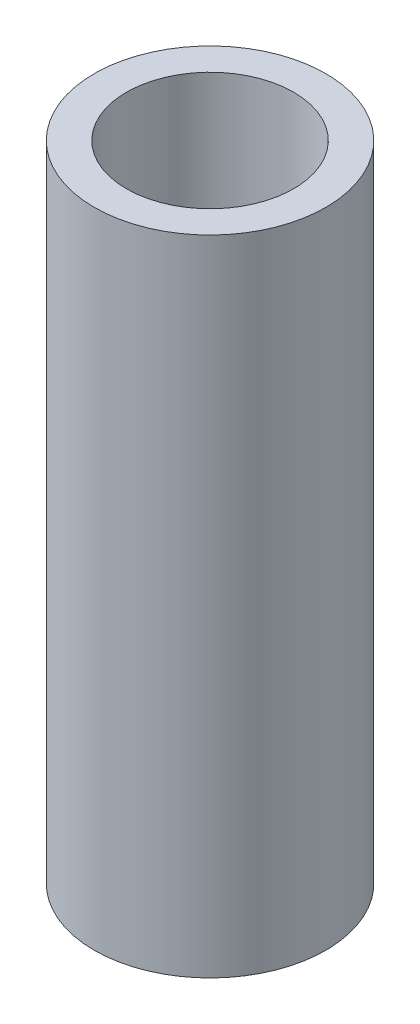
ISO-10303-21;
HEADER;
FILE_DESCRIPTION(('STEP AP214'),'2;1');
FILE_NAME('part.step','',(''),(''),'','','');
FILE_SCHEMA(('AUTOMOTIVE_DESIGN { 1 0 10303 214 1 1 1 1 }'));
ENDSEC;
DATA;
#1=APPLICATION_CONTEXT('core data for automotive mechanical design processes');
#2=APPLICATION_PROTOCOL_DEFINITION('international standard','automotive_design',2000,#1);
#3=PRODUCT_CONTEXT('',#1,'mechanical');
#4=PRODUCT('Part','Part','',(#3));
#5=PRODUCT_RELATED_PRODUCT_CATEGORY('part','',(#4));
#6=PRODUCT_DEFINITION_FORMATION('','',#4);
#7=PRODUCT_DEFINITION_CONTEXT('part definition',#1,'design');
#8=PRODUCT_DEFINITION('design','',#6,#7);
#9=PRODUCT_DEFINITION_SHAPE('','',#8);
#10=(LENGTH_UNIT() NAMED_UNIT(*) SI_UNIT(.MILLI.,.METRE.));
#11=(NAMED_UNIT(*) PLANE_ANGLE_UNIT() SI_UNIT($,.RADIAN.));
#12=(NAMED_UNIT(*) SI_UNIT($,.STERADIAN.) SOLID_ANGLE_UNIT());
#13=UNCERTAINTY_MEASURE_WITH_UNIT(LENGTH_MEASURE(1.E-05),#10,'distance_accuracy_value','');
#14=(GEOMETRIC_REPRESENTATION_CONTEXT(3) GLOBAL_UNCERTAINTY_ASSIGNED_CONTEXT((#13)) GLOBAL_UNIT_ASSIGNED_CONTEXT((#10,
#11,#12)) REPRESENTATION_CONTEXT('',''));
#15=CARTESIAN_POINT('',(0.,0.,0.));
#16=DIRECTION('',(0.,0.,1.));
#17=DIRECTION('',(1.,0.,0.));
#18=AXIS2_PLACEMENT_3D('',#15,#16,#17);
#19=CARTESIAN_POINT('',(0.,25.,0.));
#20=DIRECTION('',(0.,1.,0.));
#21=DIRECTION('',(0.,0.,1.));
#22=AXIS2_PLACEMENT_3D('',#19,#20,#21);
#23=PLANE('',#22);
#24=CARTESIAN_POINT('',(0.,25.,0.));
#25=DIRECTION('',(0.,1.,0.));
#26=DIRECTION('',(0.,0.,1.));
#27=AXIS2_PLACEMENT_3D('',#24,#25,#26);
#28=CIRCLE('',#27,4.5);
#29=CARTESIAN_POINT('',(0.,25.,4.5));
#30=VERTEX_POINT('',#29);
#31=EDGE_CURVE('E10',#30,#30,#28,.T.);
#32=ORIENTED_EDGE('',*,*,#31,.T.);
#33=EDGE_LOOP('',(#32));
#34=FACE_BOUND('',#33,.T.);
#35=CARTESIAN_POINT('',(0.,25.,0.));
#36=DIRECTION('',(0.,1.,0.));
#37=DIRECTION('',(0.,0.,1.));
#38=AXIS2_PLACEMENT_3D('',#35,#36,#37);
#39=CIRCLE('',#38,3.25);
#40=CARTESIAN_POINT('',(0.,25.,3.25));
#41=VERTEX_POINT('',#40);
#42=EDGE_CURVE('E42',#41,#41,#39,.T.);
#43=ORIENTED_EDGE('',*,*,#42,.F.);
#44=EDGE_LOOP('',(#43));
#45=FACE_BOUND('',#44,.T.);
#46=ADVANCED_FACE('F31',(#34,#45),#23,.T.);
#47=CARTESIAN_POINT('',(0.,0.,0.));
#48=DIRECTION('',(0.,1.,0.));
#49=DIRECTION('',(0.,0.,1.));
#50=AXIS2_PLACEMENT_3D('',#47,#48,#49);
#51=PLANE('',#50);
#52=CARTESIAN_POINT('',(0.,0.,0.));
#53=DIRECTION('',(0.,1.,0.));
#54=DIRECTION('',(0.,0.,1.));
#55=AXIS2_PLACEMENT_3D('',#52,#53,#54);
#56=CIRCLE('',#55,4.5);
#57=CARTESIAN_POINT('',(0.,0.,4.5));
#58=VERTEX_POINT('',#57);
#59=EDGE_CURVE('E35',#58,#58,#56,.T.);
#60=ORIENTED_EDGE('',*,*,#59,.F.);
#61=EDGE_LOOP('',(#60));
#62=FACE_BOUND('',#61,.T.);
#63=CARTESIAN_POINT('',(0.,0.,0.));
#64=DIRECTION('',(0.,1.,0.));
#65=DIRECTION('',(0.,0.,1.));
#66=AXIS2_PLACEMENT_3D('',#63,#64,#65);
#67=CIRCLE('',#66,3.25);
#68=CARTESIAN_POINT('',(0.,0.,3.25));
#69=VERTEX_POINT('',#68);
#70=EDGE_CURVE('E44',#69,#69,#67,.T.);
#71=ORIENTED_EDGE('',*,*,#70,.T.);
#72=EDGE_LOOP('',(#71));
#73=FACE_BOUND('',#72,.T.);
#74=ADVANCED_FACE('F54',(#62,#73),#51,.F.);
#75=CARTESIAN_POINT('',(0.,25.,0.));
#76=DIRECTION('',(0.,-1.,0.));
#77=DIRECTION('',(0.,0.,-1.));
#78=AXIS2_PLACEMENT_3D('',#75,#76,#77);
#79=CYLINDRICAL_SURFACE('',#78,4.5);
#80=ORIENTED_EDGE('',*,*,#31,.F.);
#81=EDGE_LOOP('',(#80));
#82=FACE_BOUND('',#81,.T.);
#83=ORIENTED_EDGE('',*,*,#59,.T.);
#84=EDGE_LOOP('',(#83));
#85=FACE_BOUND('',#84,.T.);
#86=ADVANCED_FACE('F33',(#82,#85),#79,.T.);
#87=CARTESIAN_POINT('',(0.,25.,0.));
#88=DIRECTION('',(0.,-1.,0.));
#89=DIRECTION('',(0.,0.,-1.));
#90=AXIS2_PLACEMENT_3D('',#87,#88,#89);
#91=CYLINDRICAL_SURFACE('',#90,3.25);
#92=ORIENTED_EDGE('',*,*,#42,.T.);
#93=EDGE_LOOP('',(#92));
#94=FACE_BOUND('',#93,.T.);
#95=ORIENTED_EDGE('',*,*,#70,.F.);
#96=EDGE_LOOP('',(#95));
#97=FACE_BOUND('',#96,.T.);
#98=ADVANCED_FACE('F50',(#94,#97),#91,.F.);
#99=CLOSED_SHELL('',(#46,#74,#86,#98));
#100=MANIFOLD_SOLID_BREP('B2',#99);
#101=ADVANCED_BREP_SHAPE_REPRESENTATION('',(#18,#100),#14);
#102=SHAPE_DEFINITION_REPRESENTATION(#9,#101);
ENDSEC;
END-ISO-10303-21;
